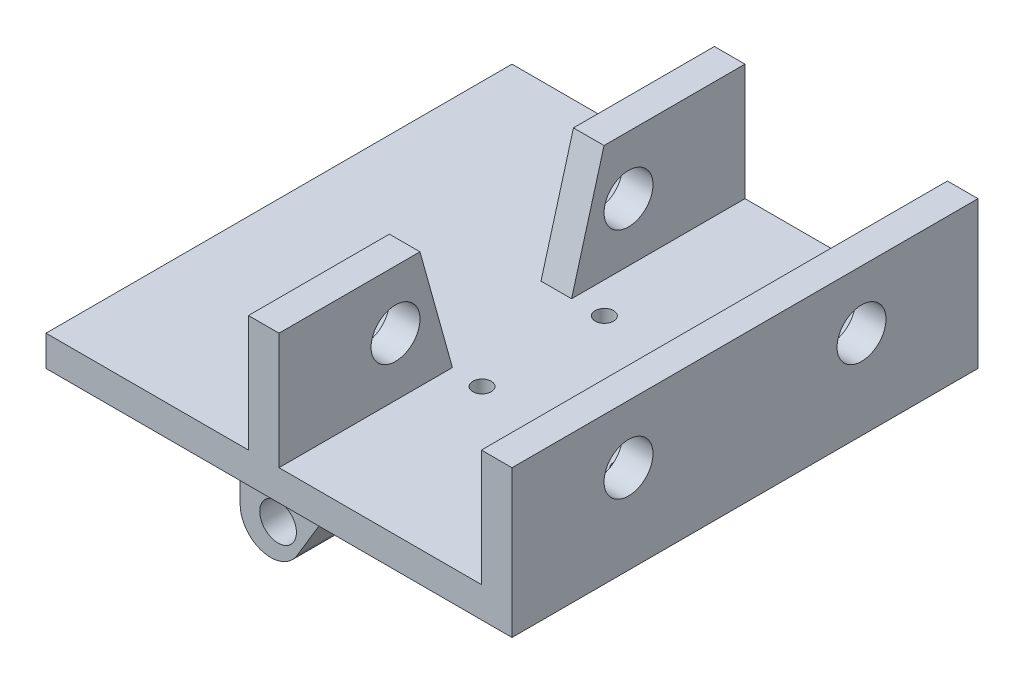
ISO-10303-21;
HEADER;
FILE_DESCRIPTION(('STEP AP214'),'2;1');
FILE_NAME('part.step','',(''),(''),'','','');
FILE_SCHEMA(('AUTOMOTIVE_DESIGN { 1 0 10303 214 1 1 1 1 }'));
ENDSEC;
DATA;
#1=APPLICATION_CONTEXT('core data for automotive mechanical design processes');
#2=APPLICATION_PROTOCOL_DEFINITION('international standard','automotive_design',2000,#1);
#3=PRODUCT_CONTEXT('',#1,'mechanical');
#4=PRODUCT('Part','Part','',(#3));
#5=PRODUCT_RELATED_PRODUCT_CATEGORY('part','',(#4));
#6=PRODUCT_DEFINITION_FORMATION('','',#4);
#7=PRODUCT_DEFINITION_CONTEXT('part definition',#1,'design');
#8=PRODUCT_DEFINITION('design','',#6,#7);
#9=PRODUCT_DEFINITION_SHAPE('','',#8);
#10=(LENGTH_UNIT() NAMED_UNIT(*) SI_UNIT(.MILLI.,.METRE.));
#11=(NAMED_UNIT(*) PLANE_ANGLE_UNIT() SI_UNIT($,.RADIAN.));
#12=(NAMED_UNIT(*) SI_UNIT($,.STERADIAN.) SOLID_ANGLE_UNIT());
#13=UNCERTAINTY_MEASURE_WITH_UNIT(LENGTH_MEASURE(1.E-05),#10,'distance_accuracy_value','');
#14=(GEOMETRIC_REPRESENTATION_CONTEXT(3) GLOBAL_UNCERTAINTY_ASSIGNED_CONTEXT((#13)) GLOBAL_UNIT_ASSIGNED_CONTEXT((#10,
#11,#12)) REPRESENTATION_CONTEXT('',''));
#15=CARTESIAN_POINT('',(0.,0.,0.));
#16=DIRECTION('',(0.,0.,1.));
#17=DIRECTION('',(1.,0.,0.));
#18=AXIS2_PLACEMENT_3D('',#15,#16,#17);
#19=CARTESIAN_POINT('',(-4.99999999999998,24.05,38.1));
#20=DIRECTION('',(0.,1.,0.));
#21=DIRECTION('',(0.,0.,1.));
#22=AXIS2_PLACEMENT_3D('',#19,#20,#21);
#23=PLANE('',#22);
#24=DIRECTION('',(1.,0.,0.));
#25=VECTOR('',#24,1.);
#26=CARTESIAN_POINT('',(-10.,24.05,15.05));
#27=LINE('',#26,#25);
#28=CARTESIAN_POINT('',(-4.99999999999998,24.05,15.05));
#29=VERTEX_POINT('',#28);
#30=CARTESIAN_POINT('',(0.,24.05,15.05));
#31=VERTEX_POINT('',#30);
#32=EDGE_CURVE('E408',#29,#31,#27,.T.);
#33=ORIENTED_EDGE('',*,*,#32,.F.);
#34=DIRECTION('',(0.,0.,1.));
#35=VECTOR('',#34,1.);
#36=CARTESIAN_POINT('',(-4.99999999999998,24.05,38.1));
#37=LINE('',#36,#35);
#38=CARTESIAN_POINT('',(-4.99999999999998,24.05,38.1));
#39=VERTEX_POINT('',#38);
#40=EDGE_CURVE('E381',#29,#39,#37,.T.);
#41=ORIENTED_EDGE('',*,*,#40,.T.);
#42=DIRECTION('',(1.,0.,0.));
#43=VECTOR('',#42,1.);
#44=CARTESIAN_POINT('',(-4.99999999999998,24.05,38.1));
#45=LINE('',#44,#43);
#46=CARTESIAN_POINT('',(0.,24.05,38.1));
#47=VERTEX_POINT('',#46);
#48=EDGE_CURVE('E204',#39,#47,#45,.T.);
#49=ORIENTED_EDGE('',*,*,#48,.T.);
#50=DIRECTION('',(0.,0.,1.));
#51=VECTOR('',#50,1.);
#52=CARTESIAN_POINT('',(0.,24.05,38.1));
#53=LINE('',#52,#51);
#54=EDGE_CURVE('E392',#31,#47,#53,.T.);
#55=ORIENTED_EDGE('',*,*,#54,.F.);
#56=EDGE_LOOP('',(#33,#41,#49,#55));
#57=FACE_BOUND('',#56,.T.);
#58=ADVANCED_FACE('F39',(#57),#23,.T.);
#59=CARTESIAN_POINT('',(-4.99999999999998,0.,0.));
#60=DIRECTION('',(-1.,0.,0.));
#61=DIRECTION('',(0.,0.,1.));
#62=AXIS2_PLACEMENT_3D('',#59,#60,#61);
#63=PLANE('',#62);
#64=DIRECTION('',(0.,0.963321996072031,0.268348154239596));
#65=VECTOR('',#64,1.);
#66=CARTESIAN_POINT('',(-4.99999999999998,-2.15865237593886,7.74917689114563));
#67=LINE('',#66,#65);
#68=CARTESIAN_POINT('',(-4.99999999999998,5.,9.74332958334934));
#69=VERTEX_POINT('',#68);
#70=EDGE_CURVE('E417',#69,#29,#67,.T.);
#71=ORIENTED_EDGE('',*,*,#70,.F.);
#72=DIRECTION('',(0.,0.,1.));
#73=VECTOR('',#72,1.);
#74=CARTESIAN_POINT('',(-4.99999999999998,5.,0.));
#75=LINE('',#74,#73);
#76=CARTESIAN_POINT('',(-4.99999999999998,5.,38.1));
#77=VERTEX_POINT('',#76);
#78=EDGE_CURVE('E197',#69,#77,#75,.T.);
#79=ORIENTED_EDGE('',*,*,#78,.T.);
#80=DIRECTION('',(0.,-1.,0.));
#81=VECTOR('',#80,1.);
#82=CARTESIAN_POINT('',(-4.99999999999998,0.,38.1));
#83=LINE('',#82,#81);
#84=EDGE_CURVE('E374',#39,#77,#83,.T.);
#85=ORIENTED_EDGE('',*,*,#84,.F.);
#86=ORIENTED_EDGE('',*,*,#40,.F.);
#87=EDGE_LOOP('',(#71,#79,#85,#86));
#88=FACE_BOUND('',#87,.T.);
#89=CARTESIAN_POINT('',(-4.99999999999998,14.525,19.05));
#90=DIRECTION('',(1.,0.,0.));
#91=DIRECTION('',(0.,0.,-1.));
#92=AXIS2_PLACEMENT_3D('',#89,#90,#91);
#93=CIRCLE('',#92,4.);
#94=CARTESIAN_POINT('',(-4.99999999999998,14.525,15.05));
#95=VERTEX_POINT('',#94);
#96=EDGE_CURVE('E366',#95,#95,#93,.T.);
#97=ORIENTED_EDGE('',*,*,#96,.T.);
#98=EDGE_LOOP('',(#97));
#99=FACE_BOUND('',#98,.T.);
#100=ADVANCED_FACE('F490',(#88,#99),#63,.T.);
#101=CARTESIAN_POINT('',(0.,0.,0.));
#102=DIRECTION('',(-1.,0.,0.));
#103=DIRECTION('',(0.,0.,1.));
#104=AXIS2_PLACEMENT_3D('',#101,#102,#103);
#105=PLANE('',#104);
#106=CARTESIAN_POINT('',(0.,14.525,19.05));
#107=DIRECTION('',(1.,0.,0.));
#108=DIRECTION('',(0.,0.,-1.));
#109=AXIS2_PLACEMENT_3D('',#106,#107,#108);
#110=CIRCLE('',#109,4.);
#111=CARTESIAN_POINT('',(0.,14.525,15.05));
#112=VERTEX_POINT('',#111);
#113=EDGE_CURVE('E362',#112,#112,#110,.T.);
#114=ORIENTED_EDGE('',*,*,#113,.F.);
#115=EDGE_LOOP('',(#114));
#116=FACE_BOUND('',#115,.T.);
#117=DIRECTION('',(0.,0.,1.));
#118=VECTOR('',#117,1.);
#119=CARTESIAN_POINT('',(0.,5.,0.));
#120=LINE('',#119,#118);
#121=CARTESIAN_POINT('',(0.,5.,9.74332958334934));
#122=VERTEX_POINT('',#121);
#123=CARTESIAN_POINT('',(0.,5.,38.1));
#124=VERTEX_POINT('',#123);
#125=EDGE_CURVE('E198',#122,#124,#120,.T.);
#126=ORIENTED_EDGE('',*,*,#125,.F.);
#127=DIRECTION('',(0.,-0.963321996072031,-0.268348154239596));
#128=VECTOR('',#127,1.);
#129=CARTESIAN_POINT('',(0.,24.05,15.05));
#130=LINE('',#129,#128);
#131=EDGE_CURVE('E55',#31,#122,#130,.T.);
#132=ORIENTED_EDGE('',*,*,#131,.F.);
#133=ORIENTED_EDGE('',*,*,#54,.T.);
#134=DIRECTION('',(0.,-1.,0.));
#135=VECTOR('',#134,1.);
#136=CARTESIAN_POINT('',(0.,0.,38.1));
#137=LINE('',#136,#135);
#138=EDGE_CURVE('E370',#47,#124,#137,.T.);
#139=ORIENTED_EDGE('',*,*,#138,.T.);
#140=EDGE_LOOP('',(#126,#132,#133,#139));
#141=FACE_BOUND('',#140,.T.);
#142=ADVANCED_FACE('F495',(#116,#141),#105,.F.);
#143=CARTESIAN_POINT('',(0.,0.,0.));
#144=DIRECTION('',(0.,1.,0.));
#145=DIRECTION('',(0.,0.,1.));
#146=AXIS2_PLACEMENT_3D('',#143,#144,#145);
#147=PLANE('',#146);
#148=CARTESIAN_POINT('',(28.1,0.,-10.));
#149=DIRECTION('',(0.,1.,0.));
#150=DIRECTION('',(0.,0.,1.));
#151=AXIS2_PLACEMENT_3D('',#148,#149,#150);
#152=CIRCLE('',#151,1.5);
#153=CARTESIAN_POINT('',(28.1,0.,-8.5));
#154=VERTEX_POINT('',#153);
#155=EDGE_CURVE('E274',#154,#154,#152,.T.);
#156=ORIENTED_EDGE('',*,*,#155,.T.);
#157=EDGE_LOOP('',(#156));
#158=FACE_BOUND('',#157,.T.);
#159=CARTESIAN_POINT('',(5.10000000000001,0.,-9.99999999999999));
#160=DIRECTION('',(0.,1.,0.));
#161=DIRECTION('',(0.,0.,1.));
#162=AXIS2_PLACEMENT_3D('',#159,#160,#161);
#163=CIRCLE('',#162,1.5);
#164=CARTESIAN_POINT('',(5.10000000000001,0.,-8.49999999999999));
#165=VERTEX_POINT('',#164);
#166=EDGE_CURVE('E266',#165,#165,#163,.T.);
#167=ORIENTED_EDGE('',*,*,#166,.T.);
#168=EDGE_LOOP('',(#167));
#169=FACE_BOUND('',#168,.T.);
#170=CARTESIAN_POINT('',(28.1,0.,10.));
#171=DIRECTION('',(0.,1.,0.));
#172=DIRECTION('',(0.,0.,-1.));
#173=AXIS2_PLACEMENT_3D('',#170,#171,#172);
#174=CIRCLE('',#173,1.5);
#175=CARTESIAN_POINT('',(28.1,0.,8.5));
#176=VERTEX_POINT('',#175);
#177=EDGE_CURVE('E258',#176,#176,#174,.T.);
#178=ORIENTED_EDGE('',*,*,#177,.T.);
#179=EDGE_LOOP('',(#178));
#180=FACE_BOUND('',#179,.T.);
#181=CARTESIAN_POINT('',(5.10000000000001,0.,9.99999999999999));
#182=DIRECTION('',(0.,1.,0.));
#183=DIRECTION('',(0.,0.,-1.));
#184=AXIS2_PLACEMENT_3D('',#181,#182,#183);
#185=CIRCLE('',#184,1.5);
#186=CARTESIAN_POINT('',(5.10000000000001,0.,8.49999999999999));
#187=VERTEX_POINT('',#186);
#188=EDGE_CURVE('E253',#187,#187,#185,.T.);
#189=ORIENTED_EDGE('',*,*,#188,.T.);
#190=EDGE_LOOP('',(#189));
#191=FACE_BOUND('',#190,.T.);
#192=DIRECTION('',(1.,0.,0.));
#193=VECTOR('',#192,1.);
#194=CARTESIAN_POINT('',(-6.09999999999999,0.,-6.34999999999999));
#195=LINE('',#194,#193);
#196=CARTESIAN_POINT('',(-38.1,0.,-6.34999999999999));
#197=VERTEX_POINT('',#196);
#198=CARTESIAN_POINT('',(-6.09999999999999,0.,-6.34999999999999));
#199=VERTEX_POINT('',#198);
#200=EDGE_CURVE('E63',#197,#199,#195,.T.);
#201=ORIENTED_EDGE('',*,*,#200,.F.);
#202=DIRECTION('',(0.,0.,1.));
#203=VECTOR('',#202,1.);
#204=CARTESIAN_POINT('',(-38.1,0.,-38.1));
#205=LINE('',#204,#203);
#206=CARTESIAN_POINT('',(-38.1,0.,-38.1));
#207=VERTEX_POINT('',#206);
#208=EDGE_CURVE('E305',#207,#197,#205,.T.);
#209=ORIENTED_EDGE('',*,*,#208,.F.);
#210=DIRECTION('',(-1.,0.,0.));
#211=VECTOR('',#210,1.);
#212=CARTESIAN_POINT('',(-38.1,0.,-38.1));
#213=LINE('',#212,#211);
#214=CARTESIAN_POINT('',(38.1,0.,-38.1));
#215=VERTEX_POINT('',#214);
#216=EDGE_CURVE('E301',#215,#207,#213,.T.);
#217=ORIENTED_EDGE('',*,*,#216,.F.);
#218=DIRECTION('',(0.,0.,-1.));
#219=VECTOR('',#218,1.);
#220=CARTESIAN_POINT('',(38.1,0.,-38.1));
#221=LINE('',#220,#219);
#222=CARTESIAN_POINT('',(38.1,0.,38.1));
#223=VERTEX_POINT('',#222);
#224=EDGE_CURVE('E282',#223,#215,#221,.T.);
#225=ORIENTED_EDGE('',*,*,#224,.F.);
#226=DIRECTION('',(1.,0.,0.));
#227=VECTOR('',#226,1.);
#228=CARTESIAN_POINT('',(-38.1,0.,38.1));
#229=LINE('',#228,#227);
#230=CARTESIAN_POINT('',(-38.1,0.,38.1));
#231=VERTEX_POINT('',#230);
#232=EDGE_CURVE('E309',#231,#223,#229,.T.);
#233=ORIENTED_EDGE('',*,*,#232,.F.);
#234=CARTESIAN_POINT('',(-38.1,0.,6.35000000000001));
#235=VERTEX_POINT('',#234);
#236=EDGE_CURVE('E304',#235,#231,#205,.T.);
#237=ORIENTED_EDGE('',*,*,#236,.F.);
#238=DIRECTION('',(1.,0.,0.));
#239=VECTOR('',#238,1.);
#240=CARTESIAN_POINT('',(-6.09999999999999,0.,6.35000000000001));
#241=LINE('',#240,#239);
#242=CARTESIAN_POINT('',(-6.09999999999999,0.,6.35000000000001));
#243=VERTEX_POINT('',#242);
#244=EDGE_CURVE('E357',#235,#243,#241,.T.);
#245=ORIENTED_EDGE('',*,*,#244,.T.);
#246=DIRECTION('',(0.,0.,-1.));
#247=VECTOR('',#246,1.);
#248=CARTESIAN_POINT('',(-6.09999999999999,0.,6.35000000000001));
#249=LINE('',#248,#247);
#250=EDGE_CURVE('E334',#243,#199,#249,.T.);
#251=ORIENTED_EDGE('',*,*,#250,.T.);
#252=EDGE_LOOP('',(#201,#209,#217,#225,#233,#237,#245,#251));
#253=FACE_BOUND('',#252,.T.);
#254=ADVANCED_FACE('F330',(#158,#169,#180,#191,#253),#147,.F.);
#255=CARTESIAN_POINT('',(0.,5.,0.));
#256=DIRECTION('',(0.,1.,0.));
#257=DIRECTION('',(0.,0.,1.));
#258=AXIS2_PLACEMENT_3D('',#255,#256,#257);
#259=PLANE('',#258);
#260=ORIENTED_EDGE('',*,*,#78,.F.);
#261=DIRECTION('',(1.,0.,0.));
#262=VECTOR('',#261,1.);
#263=CARTESIAN_POINT('',(-10.,5.,9.74332958334934));
#264=LINE('',#263,#262);
#265=EDGE_CURVE('E178',#69,#122,#264,.T.);
#266=ORIENTED_EDGE('',*,*,#265,.T.);
#267=ORIENTED_EDGE('',*,*,#125,.T.);
#268=DIRECTION('',(1.,0.,0.));
#269=VECTOR('',#268,1.);
#270=CARTESIAN_POINT('',(-38.1,5.,38.1));
#271=LINE('',#270,#269);
#272=CARTESIAN_POINT('',(33.1,5.,38.1));
#273=VERTEX_POINT('',#272);
#274=EDGE_CURVE('E292',#124,#273,#271,.T.);
#275=ORIENTED_EDGE('',*,*,#274,.T.);
#276=DIRECTION('',(0.,0.,1.));
#277=VECTOR('',#276,1.);
#278=CARTESIAN_POINT('',(33.1,5.,0.));
#279=LINE('',#278,#277);
#280=CARTESIAN_POINT('',(33.1,5.,-38.1));
#281=VERTEX_POINT('',#280);
#282=EDGE_CURVE('E246',#281,#273,#279,.T.);
#283=ORIENTED_EDGE('',*,*,#282,.F.);
#284=DIRECTION('',(-1.,0.,0.));
#285=VECTOR('',#284,1.);
#286=CARTESIAN_POINT('',(-38.1,5.,-38.1));
#287=LINE('',#286,#285);
#288=CARTESIAN_POINT('',(0.,5.,-38.1));
#289=VERTEX_POINT('',#288);
#290=EDGE_CURVE('E195',#281,#289,#287,.T.);
#291=ORIENTED_EDGE('',*,*,#290,.T.);
#292=CARTESIAN_POINT('',(0.,5.,-9.74332958334936));
#293=VERTEX_POINT('',#292);
#294=EDGE_CURVE('E184',#289,#293,#120,.T.);
#295=ORIENTED_EDGE('',*,*,#294,.T.);
#296=DIRECTION('',(1.,0.,0.));
#297=VECTOR('',#296,1.);
#298=CARTESIAN_POINT('',(-10.,5.,-9.74332958334936));
#299=LINE('',#298,#297);
#300=CARTESIAN_POINT('',(-4.99999999999998,5.,-9.74332958334936));
#301=VERTEX_POINT('',#300);
#302=EDGE_CURVE('E165',#301,#293,#299,.T.);
#303=ORIENTED_EDGE('',*,*,#302,.F.);
#304=CARTESIAN_POINT('',(-4.99999999999998,5.,-38.1));
#305=VERTEX_POINT('',#304);
#306=EDGE_CURVE('E202',#305,#301,#75,.T.);
#307=ORIENTED_EDGE('',*,*,#306,.F.);
#308=CARTESIAN_POINT('',(-38.1,5.,-38.1));
#309=VERTEX_POINT('',#308);
#310=EDGE_CURVE('E289',#305,#309,#287,.T.);
#311=ORIENTED_EDGE('',*,*,#310,.T.);
#312=DIRECTION('',(0.,0.,1.));
#313=VECTOR('',#312,1.);
#314=CARTESIAN_POINT('',(-38.1,5.,-38.1));
#315=LINE('',#314,#313);
#316=CARTESIAN_POINT('',(-38.1,5.,38.1));
#317=VERTEX_POINT('',#316);
#318=EDGE_CURVE('E288',#309,#317,#315,.T.);
#319=ORIENTED_EDGE('',*,*,#318,.T.);
#320=EDGE_CURVE('E293',#317,#77,#271,.T.);
#321=ORIENTED_EDGE('',*,*,#320,.T.);
#322=EDGE_LOOP('',(#260,#266,#267,#275,#283,#291,#295,#303,#307,#311,#319,#321));
#323=FACE_BOUND('',#322,.T.);
#324=CARTESIAN_POINT('',(28.1,5.,10.));
#325=DIRECTION('',(0.,1.,0.));
#326=DIRECTION('',(0.,0.,-1.));
#327=AXIS2_PLACEMENT_3D('',#324,#325,#326);
#328=CIRCLE('',#327,1.5);
#329=CARTESIAN_POINT('',(28.1,5.,8.5));
#330=VERTEX_POINT('',#329);
#331=EDGE_CURVE('E262',#330,#330,#328,.T.);
#332=ORIENTED_EDGE('',*,*,#331,.F.);
#333=EDGE_LOOP('',(#332));
#334=FACE_BOUND('',#333,.T.);
#335=CARTESIAN_POINT('',(28.1,5.,-10.));
#336=DIRECTION('',(0.,1.,0.));
#337=DIRECTION('',(0.,0.,1.));
#338=AXIS2_PLACEMENT_3D('',#335,#336,#337);
#339=CIRCLE('',#338,1.5);
#340=CARTESIAN_POINT('',(28.1,5.,-8.5));
#341=VERTEX_POINT('',#340);
#342=EDGE_CURVE('E278',#341,#341,#339,.T.);
#343=ORIENTED_EDGE('',*,*,#342,.F.);
#344=EDGE_LOOP('',(#343));
#345=FACE_BOUND('',#344,.T.);
#346=CARTESIAN_POINT('',(5.10000000000001,5.,-9.99999999999999));
#347=DIRECTION('',(0.,1.,0.));
#348=DIRECTION('',(0.,0.,1.));
#349=AXIS2_PLACEMENT_3D('',#346,#347,#348);
#350=CIRCLE('',#349,1.5);
#351=CARTESIAN_POINT('',(5.10000000000001,5.,-8.49999999999999));
#352=VERTEX_POINT('',#351);
#353=EDGE_CURVE('E270',#352,#352,#350,.T.);
#354=ORIENTED_EDGE('',*,*,#353,.F.);
#355=EDGE_LOOP('',(#354));
#356=FACE_BOUND('',#355,.T.);
#357=CARTESIAN_POINT('',(5.10000000000001,5.,9.99999999999999));
#358=DIRECTION('',(0.,1.,0.));
#359=DIRECTION('',(0.,0.,-1.));
#360=AXIS2_PLACEMENT_3D('',#357,#358,#359);
#361=CIRCLE('',#360,1.5);
#362=CARTESIAN_POINT('',(5.10000000000001,5.,8.49999999999999));
#363=VERTEX_POINT('',#362);
#364=EDGE_CURVE('E254',#363,#363,#361,.T.);
#365=ORIENTED_EDGE('',*,*,#364,.F.);
#366=EDGE_LOOP('',(#365));
#367=FACE_BOUND('',#366,.T.);
#368=ADVANCED_FACE('F192',(#323,#334,#345,#356,#367),#259,.T.);
#369=CARTESIAN_POINT('',(38.1,5.,-38.1));
#370=DIRECTION('',(-1.,0.,0.));
#371=DIRECTION('',(0.,0.,1.));
#372=AXIS2_PLACEMENT_3D('',#369,#370,#371);
#373=PLANE('',#372);
#374=ORIENTED_EDGE('',*,*,#224,.T.);
#375=DIRECTION('',(0.,-1.,0.));
#376=VECTOR('',#375,1.);
#377=CARTESIAN_POINT('',(38.1,5.,-38.1));
#378=LINE('',#377,#376);
#379=CARTESIAN_POINT('',(38.1,24.05,-38.1));
#380=VERTEX_POINT('',#379);
#381=EDGE_CURVE('E11',#380,#215,#378,.T.);
#382=ORIENTED_EDGE('',*,*,#381,.F.);
#383=DIRECTION('',(0.,0.,1.));
#384=VECTOR('',#383,1.);
#385=CARTESIAN_POINT('',(38.1,24.05,38.1));
#386=LINE('',#385,#384);
#387=CARTESIAN_POINT('',(38.1,24.05,38.1));
#388=VERTEX_POINT('',#387);
#389=EDGE_CURVE('E223',#380,#388,#386,.T.);
#390=ORIENTED_EDGE('',*,*,#389,.T.);
#391=DIRECTION('',(0.,-1.,0.));
#392=VECTOR('',#391,1.);
#393=CARTESIAN_POINT('',(38.1,5.,38.1));
#394=LINE('',#393,#392);
#395=EDGE_CURVE('E297',#388,#223,#394,.T.);
#396=ORIENTED_EDGE('',*,*,#395,.T.);
#397=EDGE_LOOP('',(#374,#382,#390,#396));
#398=FACE_BOUND('',#397,.T.);
#399=CARTESIAN_POINT('',(38.1,14.525,-19.05));
#400=DIRECTION('',(1.,0.,0.));
#401=DIRECTION('',(0.,0.,-1.));
#402=AXIS2_PLACEMENT_3D('',#399,#400,#401);
#403=CIRCLE('',#402,4.);
#404=CARTESIAN_POINT('',(38.1,14.525,-23.05));
#405=VERTEX_POINT('',#404);
#406=EDGE_CURVE('E210',#405,#405,#403,.T.);
#407=ORIENTED_EDGE('',*,*,#406,.F.);
#408=EDGE_LOOP('',(#407));
#409=FACE_BOUND('',#408,.T.);
#410=CARTESIAN_POINT('',(38.1,14.525,19.05));
#411=DIRECTION('',(1.,0.,0.));
#412=DIRECTION('',(0.,0.,-1.));
#413=AXIS2_PLACEMENT_3D('',#410,#411,#412);
#414=CIRCLE('',#413,4.);
#415=CARTESIAN_POINT('',(38.1,14.525,15.05));
#416=VERTEX_POINT('',#415);
#417=EDGE_CURVE('E215',#416,#416,#414,.T.);
#418=ORIENTED_EDGE('',*,*,#417,.F.);
#419=EDGE_LOOP('',(#418));
#420=FACE_BOUND('',#419,.T.);
#421=ADVANCED_FACE('F41',(#398,#409,#420),#373,.F.);
#422=CARTESIAN_POINT('',(-38.1,5.,-38.1));
#423=DIRECTION('',(0.,0.,1.));
#424=DIRECTION('',(1.,0.,0.));
#425=AXIS2_PLACEMENT_3D('',#422,#423,#424);
#426=PLANE('',#425);
#427=ORIENTED_EDGE('',*,*,#310,.F.);
#428=DIRECTION('',(0.,1.,0.));
#429=VECTOR('',#428,1.);
#430=CARTESIAN_POINT('',(-4.99999999999998,0.,-38.1));
#431=LINE('',#430,#429);
#432=CARTESIAN_POINT('',(-4.99999999999998,24.05,-38.1));
#433=VERTEX_POINT('',#432);
#434=EDGE_CURVE('E378',#305,#433,#431,.T.);
#435=ORIENTED_EDGE('',*,*,#434,.T.);
#436=DIRECTION('',(1.,0.,0.));
#437=VECTOR('',#436,1.);
#438=CARTESIAN_POINT('',(-4.99999999999998,24.05,-38.1));
#439=LINE('',#438,#437);
#440=CARTESIAN_POINT('',(0.,24.05,-38.1));
#441=VERTEX_POINT('',#440);
#442=EDGE_CURVE('E206',#433,#441,#439,.T.);
#443=ORIENTED_EDGE('',*,*,#442,.T.);
#444=DIRECTION('',(0.,1.,0.));
#445=VECTOR('',#444,1.);
#446=CARTESIAN_POINT('',(0.,0.,-38.1));
#447=LINE('',#446,#445);
#448=EDGE_CURVE('E389',#289,#441,#447,.T.);
#449=ORIENTED_EDGE('',*,*,#448,.F.);
#450=ORIENTED_EDGE('',*,*,#290,.F.);
#451=DIRECTION('',(0.,1.,0.));
#452=VECTOR('',#451,1.);
#453=CARTESIAN_POINT('',(33.1,0.,-38.1));
#454=LINE('',#453,#452);
#455=CARTESIAN_POINT('',(33.1,24.05,-38.1));
#456=VERTEX_POINT('',#455);
#457=EDGE_CURVE('E231',#281,#456,#454,.T.);
#458=ORIENTED_EDGE('',*,*,#457,.T.);
#459=DIRECTION('',(1.,0.,0.));
#460=VECTOR('',#459,1.);
#461=CARTESIAN_POINT('',(33.1,24.05,-38.1));
#462=LINE('',#461,#460);
#463=EDGE_CURVE('E238',#456,#380,#462,.T.);
#464=ORIENTED_EDGE('',*,*,#463,.T.);
#465=ORIENTED_EDGE('',*,*,#381,.T.);
#466=ORIENTED_EDGE('',*,*,#216,.T.);
#467=DIRECTION('',(0.,-1.,0.));
#468=VECTOR('',#467,1.);
#469=CARTESIAN_POINT('',(-38.1,5.,-38.1));
#470=LINE('',#469,#468);
#471=EDGE_CURVE('E48',#309,#207,#470,.T.);
#472=ORIENTED_EDGE('',*,*,#471,.F.);
#473=EDGE_LOOP('',(#427,#435,#443,#449,#450,#458,#464,#465,#466,#472));
#474=FACE_BOUND('',#473,.T.);
#475=ADVANCED_FACE('F403',(#474),#426,.F.);
#476=CARTESIAN_POINT('',(-38.1,5.,-38.1));
#477=DIRECTION('',(1.,0.,0.));
#478=DIRECTION('',(0.,0.,-1.));
#479=AXIS2_PLACEMENT_3D('',#476,#477,#478);
#480=PLANE('',#479);
#481=ORIENTED_EDGE('',*,*,#208,.T.);
#482=DIRECTION('',(0.,1.,0.));
#483=VECTOR('',#482,1.);
#484=CARTESIAN_POINT('',(-38.1,0.,-6.34999999999999));
#485=LINE('',#484,#483);
#486=CARTESIAN_POINT('',(-38.1,-35.1482677807421,-6.34999999999999));
#487=VERTEX_POINT('',#486);
#488=EDGE_CURVE('E337',#487,#197,#485,.T.);
#489=ORIENTED_EDGE('',*,*,#488,.F.);
#490=DIRECTION('',(0.,0.,-1.));
#491=VECTOR('',#490,1.);
#492=CARTESIAN_POINT('',(-38.1,-35.1482677807421,6.35000000000001));
#493=LINE('',#492,#491);
#494=CARTESIAN_POINT('',(-38.1,-35.1482677807421,6.35000000000001));
#495=VERTEX_POINT('',#494);
#496=EDGE_CURVE('E351',#495,#487,#493,.T.);
#497=ORIENTED_EDGE('',*,*,#496,.F.);
#498=DIRECTION('',(0.,1.,0.));
#499=VECTOR('',#498,1.);
#500=CARTESIAN_POINT('',(-38.1,0.,6.35000000000001));
#501=LINE('',#500,#499);
#502=EDGE_CURVE('E432',#495,#235,#501,.T.);
#503=ORIENTED_EDGE('',*,*,#502,.T.);
#504=ORIENTED_EDGE('',*,*,#236,.T.);
#505=DIRECTION('',(0.,-1.,0.));
#506=VECTOR('',#505,1.);
#507=CARTESIAN_POINT('',(-38.1,5.,38.1));
#508=LINE('',#507,#506);
#509=EDGE_CURVE('E315',#317,#231,#508,.T.);
#510=ORIENTED_EDGE('',*,*,#509,.F.);
#511=ORIENTED_EDGE('',*,*,#318,.F.);
#512=ORIENTED_EDGE('',*,*,#471,.T.);
#513=EDGE_LOOP('',(#481,#489,#497,#503,#504,#510,#511,#512));
#514=FACE_BOUND('',#513,.T.);
#515=ADVANCED_FACE('F324',(#514),#480,.F.);
#516=CARTESIAN_POINT('',(-38.1,5.,38.1));
#517=DIRECTION('',(0.,0.,-1.));
#518=DIRECTION('',(-1.,0.,0.));
#519=AXIS2_PLACEMENT_3D('',#516,#517,#518);
#520=PLANE('',#519);
#521=ORIENTED_EDGE('',*,*,#232,.T.);
#522=ORIENTED_EDGE('',*,*,#395,.F.);
#523=DIRECTION('',(1.,0.,0.));
#524=VECTOR('',#523,1.);
#525=CARTESIAN_POINT('',(33.1,24.05,38.1));
#526=LINE('',#525,#524);
#527=CARTESIAN_POINT('',(33.1,24.05,38.1));
#528=VERTEX_POINT('',#527);
#529=EDGE_CURVE('E242',#528,#388,#526,.T.);
#530=ORIENTED_EDGE('',*,*,#529,.F.);
#531=DIRECTION('',(0.,-1.,0.));
#532=VECTOR('',#531,1.);
#533=CARTESIAN_POINT('',(33.1,0.,38.1));
#534=LINE('',#533,#532);
#535=EDGE_CURVE('E227',#528,#273,#534,.T.);
#536=ORIENTED_EDGE('',*,*,#535,.T.);
#537=ORIENTED_EDGE('',*,*,#274,.F.);
#538=ORIENTED_EDGE('',*,*,#138,.F.);
#539=ORIENTED_EDGE('',*,*,#48,.F.);
#540=ORIENTED_EDGE('',*,*,#84,.T.);
#541=ORIENTED_EDGE('',*,*,#320,.F.);
#542=ORIENTED_EDGE('',*,*,#509,.T.);
#543=EDGE_LOOP('',(#521,#522,#530,#536,#537,#538,#539,#540,#541,#542));
#544=FACE_BOUND('',#543,.T.);
#545=ADVANCED_FACE('F463',(#544),#520,.F.);
#546=CARTESIAN_POINT('',(28.1,5.,-10.));
#547=DIRECTION('',(0.,-1.,0.));
#548=DIRECTION('',(0.,0.,-1.));
#549=AXIS2_PLACEMENT_3D('',#546,#547,#548);
#550=CYLINDRICAL_SURFACE('',#549,1.5);
#551=ORIENTED_EDGE('',*,*,#342,.T.);
#552=EDGE_LOOP('',(#551));
#553=FACE_BOUND('',#552,.T.);
#554=ORIENTED_EDGE('',*,*,#155,.F.);
#555=EDGE_LOOP('',(#554));
#556=FACE_BOUND('',#555,.T.);
#557=ADVANCED_FACE('F642',(#553,#556),#550,.F.);
#558=CARTESIAN_POINT('',(5.10000000000001,5.,-9.99999999999999));
#559=DIRECTION('',(0.,-1.,0.));
#560=DIRECTION('',(0.,0.,-1.));
#561=AXIS2_PLACEMENT_3D('',#558,#559,#560);
#562=CYLINDRICAL_SURFACE('',#561,1.5);
#563=ORIENTED_EDGE('',*,*,#353,.T.);
#564=EDGE_LOOP('',(#563));
#565=FACE_BOUND('',#564,.T.);
#566=ORIENTED_EDGE('',*,*,#166,.F.);
#567=EDGE_LOOP('',(#566));
#568=FACE_BOUND('',#567,.T.);
#569=ADVANCED_FACE('F648',(#565,#568),#562,.F.);
#570=CARTESIAN_POINT('',(28.1,5.,10.));
#571=DIRECTION('',(0.,-1.,0.));
#572=DIRECTION('',(0.,0.,-1.));
#573=AXIS2_PLACEMENT_3D('',#570,#571,#572);
#574=CYLINDRICAL_SURFACE('',#573,1.5);
#575=ORIENTED_EDGE('',*,*,#331,.T.);
#576=EDGE_LOOP('',(#575));
#577=FACE_BOUND('',#576,.T.);
#578=ORIENTED_EDGE('',*,*,#177,.F.);
#579=EDGE_LOOP('',(#578));
#580=FACE_BOUND('',#579,.T.);
#581=ADVANCED_FACE('F656',(#577,#580),#574,.F.);
#582=CARTESIAN_POINT('',(5.10000000000001,5.,9.99999999999999));
#583=DIRECTION('',(0.,-1.,0.));
#584=DIRECTION('',(0.,0.,-1.));
#585=AXIS2_PLACEMENT_3D('',#582,#583,#584);
#586=CYLINDRICAL_SURFACE('',#585,1.5);
#587=ORIENTED_EDGE('',*,*,#364,.T.);
#588=EDGE_LOOP('',(#587));
#589=FACE_BOUND('',#588,.T.);
#590=ORIENTED_EDGE('',*,*,#188,.F.);
#591=EDGE_LOOP('',(#590));
#592=FACE_BOUND('',#591,.T.);
#593=ADVANCED_FACE('F664',(#589,#592),#586,.F.);
#594=CARTESIAN_POINT('',(33.1,24.05,38.1));
#595=DIRECTION('',(0.,1.,0.));
#596=DIRECTION('',(0.,0.,1.));
#597=AXIS2_PLACEMENT_3D('',#594,#595,#596);
#598=PLANE('',#597);
#599=ORIENTED_EDGE('',*,*,#389,.F.);
#600=ORIENTED_EDGE('',*,*,#463,.F.);
#601=DIRECTION('',(0.,0.,1.));
#602=VECTOR('',#601,1.);
#603=CARTESIAN_POINT('',(33.1,24.05,38.1));
#604=LINE('',#603,#602);
#605=EDGE_CURVE('E234',#456,#528,#604,.T.);
#606=ORIENTED_EDGE('',*,*,#605,.T.);
#607=ORIENTED_EDGE('',*,*,#529,.T.);
#608=EDGE_LOOP('',(#599,#600,#606,#607));
#609=FACE_BOUND('',#608,.T.);
#610=ADVANCED_FACE('F466',(#609),#598,.T.);
#611=CARTESIAN_POINT('',(33.1,0.,0.));
#612=DIRECTION('',(-1.,0.,0.));
#613=DIRECTION('',(0.,0.,1.));
#614=AXIS2_PLACEMENT_3D('',#611,#612,#613);
#615=PLANE('',#614);
#616=CARTESIAN_POINT('',(33.1,14.525,-19.05));
#617=DIRECTION('',(1.,0.,0.));
#618=DIRECTION('',(0.,0.,-1.));
#619=AXIS2_PLACEMENT_3D('',#616,#617,#618);
#620=CIRCLE('',#619,4.);
#621=CARTESIAN_POINT('',(33.1,14.525,-23.05));
#622=VERTEX_POINT('',#621);
#623=EDGE_CURVE('E211',#622,#622,#620,.T.);
#624=ORIENTED_EDGE('',*,*,#623,.T.);
#625=EDGE_LOOP('',(#624));
#626=FACE_BOUND('',#625,.T.);
#627=CARTESIAN_POINT('',(33.1,14.525,19.05));
#628=DIRECTION('',(1.,0.,0.));
#629=DIRECTION('',(0.,0.,-1.));
#630=AXIS2_PLACEMENT_3D('',#627,#628,#629);
#631=CIRCLE('',#630,4.);
#632=CARTESIAN_POINT('',(33.1,14.525,15.05));
#633=VERTEX_POINT('',#632);
#634=EDGE_CURVE('E219',#633,#633,#631,.T.);
#635=ORIENTED_EDGE('',*,*,#634,.T.);
#636=EDGE_LOOP('',(#635));
#637=FACE_BOUND('',#636,.T.);
#638=ORIENTED_EDGE('',*,*,#457,.F.);
#639=ORIENTED_EDGE('',*,*,#282,.T.);
#640=ORIENTED_EDGE('',*,*,#535,.F.);
#641=ORIENTED_EDGE('',*,*,#605,.F.);
#642=EDGE_LOOP('',(#638,#639,#640,#641));
#643=FACE_BOUND('',#642,.T.);
#644=ADVANCED_FACE('F461',(#626,#637,#643),#615,.T.);
#645=CARTESIAN_POINT('',(33.1,14.525,19.05));
#646=DIRECTION('',(1.,0.,0.));
#647=DIRECTION('',(0.,0.,-1.));
#648=AXIS2_PLACEMENT_3D('',#645,#646,#647);
#649=CYLINDRICAL_SURFACE('',#648,4.);
#650=ORIENTED_EDGE('',*,*,#634,.F.);
#651=EDGE_LOOP('',(#650));
#652=FACE_BOUND('',#651,.T.);
#653=ORIENTED_EDGE('',*,*,#417,.T.);
#654=EDGE_LOOP('',(#653));
#655=FACE_BOUND('',#654,.T.);
#656=ADVANCED_FACE('F475',(#652,#655),#649,.F.);
#657=CARTESIAN_POINT('',(33.1,14.525,-19.05));
#658=DIRECTION('',(1.,0.,0.));
#659=DIRECTION('',(0.,0.,-1.));
#660=AXIS2_PLACEMENT_3D('',#657,#658,#659);
#661=CYLINDRICAL_SURFACE('',#660,4.);
#662=ORIENTED_EDGE('',*,*,#623,.F.);
#663=EDGE_LOOP('',(#662));
#664=FACE_BOUND('',#663,.T.);
#665=ORIENTED_EDGE('',*,*,#406,.T.);
#666=EDGE_LOOP('',(#665));
#667=FACE_BOUND('',#666,.T.);
#668=ADVANCED_FACE('F477',(#664,#667),#661,.F.);
#669=DIRECTION('',(1.,0.,0.));
#670=VECTOR('',#669,1.);
#671=CARTESIAN_POINT('',(-10.,24.05,-15.05));
#672=LINE('',#671,#670);
#673=CARTESIAN_POINT('',(-4.99999999999998,24.05,-15.05));
#674=VERTEX_POINT('',#673);
#675=CARTESIAN_POINT('',(0.,24.05,-15.05));
#676=VERTEX_POINT('',#675);
#677=EDGE_CURVE('E177',#674,#676,#672,.T.);
#678=ORIENTED_EDGE('',*,*,#677,.T.);
#679=EDGE_CURVE('E187',#441,#676,#53,.T.);
#680=ORIENTED_EDGE('',*,*,#679,.F.);
#681=ORIENTED_EDGE('',*,*,#442,.F.);
#682=EDGE_CURVE('E382',#433,#674,#37,.T.);
#683=ORIENTED_EDGE('',*,*,#682,.T.);
#684=EDGE_LOOP('',(#678,#680,#681,#683));
#685=FACE_BOUND('',#684,.T.);
#686=ADVANCED_FACE('F406',(#685),#23,.T.);
#687=DIRECTION('',(0.,-0.963321996072031,0.268348154239596));
#688=VECTOR('',#687,1.);
#689=CARTESIAN_POINT('',(-4.99999999999998,-2.15865237593887,-7.74917689114565));
#690=LINE('',#689,#688);
#691=EDGE_CURVE('E171',#674,#301,#690,.T.);
#692=ORIENTED_EDGE('',*,*,#691,.F.);
#693=ORIENTED_EDGE('',*,*,#682,.F.);
#694=ORIENTED_EDGE('',*,*,#434,.F.);
#695=ORIENTED_EDGE('',*,*,#306,.T.);
#696=EDGE_LOOP('',(#692,#693,#694,#695));
#697=FACE_BOUND('',#696,.T.);
#698=CARTESIAN_POINT('',(-4.99999999999998,14.525,-19.05));
#699=DIRECTION('',(1.,0.,0.));
#700=DIRECTION('',(0.,0.,-1.));
#701=AXIS2_PLACEMENT_3D('',#698,#699,#700);
#702=CIRCLE('',#701,4.);
#703=CARTESIAN_POINT('',(-4.99999999999998,14.525,-23.05));
#704=VERTEX_POINT('',#703);
#705=EDGE_CURVE('E358',#704,#704,#702,.T.);
#706=ORIENTED_EDGE('',*,*,#705,.T.);
#707=EDGE_LOOP('',(#706));
#708=FACE_BOUND('',#707,.T.);
#709=ADVANCED_FACE('F498',(#697,#708),#63,.T.);
#710=ORIENTED_EDGE('',*,*,#679,.T.);
#711=DIRECTION('',(0.,0.963321996072031,-0.268348154239596));
#712=VECTOR('',#711,1.);
#713=CARTESIAN_POINT('',(0.,24.05,-15.05));
#714=LINE('',#713,#712);
#715=EDGE_CURVE('E168',#293,#676,#714,.T.);
#716=ORIENTED_EDGE('',*,*,#715,.F.);
#717=ORIENTED_EDGE('',*,*,#294,.F.);
#718=ORIENTED_EDGE('',*,*,#448,.T.);
#719=EDGE_LOOP('',(#710,#716,#717,#718));
#720=FACE_BOUND('',#719,.T.);
#721=CARTESIAN_POINT('',(0.,14.525,-19.05));
#722=DIRECTION('',(1.,0.,0.));
#723=DIRECTION('',(0.,0.,-1.));
#724=AXIS2_PLACEMENT_3D('',#721,#722,#723);
#725=CIRCLE('',#724,4.);
#726=CARTESIAN_POINT('',(0.,14.525,-23.05));
#727=VERTEX_POINT('',#726);
#728=EDGE_CURVE('E350',#727,#727,#725,.T.);
#729=ORIENTED_EDGE('',*,*,#728,.F.);
#730=EDGE_LOOP('',(#729));
#731=FACE_BOUND('',#730,.T.);
#732=ADVANCED_FACE('F182',(#720,#731),#105,.F.);
#733=CARTESIAN_POINT('',(-4.99999999999998,14.525,19.05));
#734=DIRECTION('',(1.,0.,0.));
#735=DIRECTION('',(0.,0.,-1.));
#736=AXIS2_PLACEMENT_3D('',#733,#734,#735);
#737=CYLINDRICAL_SURFACE('',#736,4.);
#738=ORIENTED_EDGE('',*,*,#96,.F.);
#739=EDGE_LOOP('',(#738));
#740=FACE_BOUND('',#739,.T.);
#741=ORIENTED_EDGE('',*,*,#113,.T.);
#742=EDGE_LOOP('',(#741));
#743=FACE_BOUND('',#742,.T.);
#744=ADVANCED_FACE('F509',(#740,#743),#737,.F.);
#745=CARTESIAN_POINT('',(-4.99999999999998,14.525,-19.05));
#746=DIRECTION('',(1.,0.,0.));
#747=DIRECTION('',(0.,0.,-1.));
#748=AXIS2_PLACEMENT_3D('',#745,#746,#747);
#749=CYLINDRICAL_SURFACE('',#748,4.);
#750=ORIENTED_EDGE('',*,*,#705,.F.);
#751=EDGE_LOOP('',(#750));
#752=FACE_BOUND('',#751,.T.);
#753=ORIENTED_EDGE('',*,*,#728,.T.);
#754=EDGE_LOOP('',(#753));
#755=FACE_BOUND('',#754,.T.);
#756=ADVANCED_FACE('F514',(#752,#755),#749,.F.);
#757=CARTESIAN_POINT('',(-28.8165524975716,-37.7274299497305,6.35000000000001));
#758=DIRECTION('',(0.856689500485658,-0.515832433797676,0.));
#759=DIRECTION('',(0.515832433797676,0.856689500485658,0.));
#760=AXIS2_PLACEMENT_3D('',#757,#758,#759);
#761=PLANE('',#760);
#762=DIRECTION('',(-0.515832433797676,-0.856689500485658,0.));
#763=VECTOR('',#762,1.);
#764=CARTESIAN_POINT('',(-28.8165524975716,-37.7274299497305,-6.34999999999999));
#765=LINE('',#764,#763);
#766=CARTESIAN_POINT('',(-28.8165524975716,-37.7274299497305,-6.34999999999999));
#767=VERTEX_POINT('',#766);
#768=EDGE_CURVE('E425',#199,#767,#765,.T.);
#769=ORIENTED_EDGE('',*,*,#768,.F.);
#770=ORIENTED_EDGE('',*,*,#250,.F.);
#771=DIRECTION('',(-0.515832433797676,-0.856689500485658,0.));
#772=VECTOR('',#771,1.);
#773=CARTESIAN_POINT('',(-28.8165524975716,-37.7274299497305,6.35000000000001));
#774=LINE('',#773,#772);
#775=CARTESIAN_POINT('',(-28.8165524975716,-37.7274299497305,6.35000000000001));
#776=VERTEX_POINT('',#775);
#777=EDGE_CURVE('E336',#243,#776,#774,.T.);
#778=ORIENTED_EDGE('',*,*,#777,.T.);
#779=DIRECTION('',(0.,0.,-1.));
#780=VECTOR('',#779,1.);
#781=CARTESIAN_POINT('',(-28.8165524975716,-37.7274299497305,6.35000000000001));
#782=LINE('',#781,#780);
#783=EDGE_CURVE('E354',#776,#767,#782,.T.);
#784=ORIENTED_EDGE('',*,*,#783,.T.);
#785=EDGE_LOOP('',(#769,#770,#778,#784));
#786=FACE_BOUND('',#785,.T.);
#787=ADVANCED_FACE('F518',(#786),#761,.T.);
#788=CARTESIAN_POINT('',(-33.1,-35.1482677807424,6.35000000000001));
#789=DIRECTION('',(0.,0.,-1.));
#790=DIRECTION('',(-1.,0.,0.));
#791=AXIS2_PLACEMENT_3D('',#788,#789,#790);
#792=CYLINDRICAL_SURFACE('',#791,5.);
#793=CARTESIAN_POINT('',(-33.1,-35.1482677807424,-6.34999999999999));
#794=DIRECTION('',(0.,0.,-1.));
#795=DIRECTION('',(1.,0.,0.));
#796=AXIS2_PLACEMENT_3D('',#793,#794,#795);
#797=CIRCLE('',#796,5.);
#798=EDGE_CURVE('E344',#767,#487,#797,.T.);
#799=ORIENTED_EDGE('',*,*,#798,.F.);
#800=ORIENTED_EDGE('',*,*,#783,.F.);
#801=CARTESIAN_POINT('',(-33.1,-35.1482677807424,6.35000000000001));
#802=DIRECTION('',(0.,0.,-1.));
#803=DIRECTION('',(1.,0.,0.));
#804=AXIS2_PLACEMENT_3D('',#801,#802,#803);
#805=CIRCLE('',#804,5.);
#806=EDGE_CURVE('E342',#776,#495,#805,.T.);
#807=ORIENTED_EDGE('',*,*,#806,.T.);
#808=ORIENTED_EDGE('',*,*,#496,.T.);
#809=EDGE_LOOP('',(#799,#800,#807,#808));
#810=FACE_BOUND('',#809,.T.);
#811=ADVANCED_FACE('F443',(#810),#792,.T.);
#812=CARTESIAN_POINT('',(-33.1,-35.1482677807424,6.35000000000001));
#813=DIRECTION('',(0.,0.,1.));
#814=DIRECTION('',(1.,0.,0.));
#815=AXIS2_PLACEMENT_3D('',#812,#813,#814);
#816=PLANE('',#815);
#817=CARTESIAN_POINT('',(-31.9,-34.5,6.35000000000001));
#818=DIRECTION('',(0.,0.,-1.));
#819=DIRECTION('',(-1.,0.,0.));
#820=AXIS2_PLACEMENT_3D('',#817,#818,#819);
#821=CIRCLE('',#820,3.);
#822=CARTESIAN_POINT('',(-34.9,-34.5,6.35000000000001));
#823=VERTEX_POINT('',#822);
#824=EDGE_CURVE('E421',#823,#823,#821,.T.);
#825=ORIENTED_EDGE('',*,*,#824,.T.);
#826=EDGE_LOOP('',(#825));
#827=FACE_BOUND('',#826,.T.);
#828=ORIENTED_EDGE('',*,*,#777,.F.);
#829=ORIENTED_EDGE('',*,*,#244,.F.);
#830=ORIENTED_EDGE('',*,*,#502,.F.);
#831=ORIENTED_EDGE('',*,*,#806,.F.);
#832=EDGE_LOOP('',(#828,#829,#830,#831));
#833=FACE_BOUND('',#832,.T.);
#834=ADVANCED_FACE('F449',(#827,#833),#816,.T.);
#835=CARTESIAN_POINT('',(-33.1,-35.1482677807424,-6.34999999999999));
#836=DIRECTION('',(0.,0.,1.));
#837=DIRECTION('',(1.,0.,0.));
#838=AXIS2_PLACEMENT_3D('',#835,#836,#837);
#839=PLANE('',#838);
#840=CARTESIAN_POINT('',(-31.9,-34.5,-6.34999999999999));
#841=DIRECTION('',(0.,0.,-1.));
#842=DIRECTION('',(-1.,0.,0.));
#843=AXIS2_PLACEMENT_3D('',#840,#841,#842);
#844=CIRCLE('',#843,3.);
#845=CARTESIAN_POINT('',(-34.9,-34.5,-6.34999999999999));
#846=VERTEX_POINT('',#845);
#847=EDGE_CURVE('E420',#846,#846,#844,.T.);
#848=ORIENTED_EDGE('',*,*,#847,.F.);
#849=EDGE_LOOP('',(#848));
#850=FACE_BOUND('',#849,.T.);
#851=ORIENTED_EDGE('',*,*,#768,.T.);
#852=ORIENTED_EDGE('',*,*,#798,.T.);
#853=ORIENTED_EDGE('',*,*,#488,.T.);
#854=ORIENTED_EDGE('',*,*,#200,.T.);
#855=EDGE_LOOP('',(#851,#852,#853,#854));
#856=FACE_BOUND('',#855,.T.);
#857=ADVANCED_FACE('F441',(#850,#856),#839,.F.);
#858=CARTESIAN_POINT('',(-31.9,-34.5,6.35000000000001));
#859=DIRECTION('',(0.,0.,-1.));
#860=DIRECTION('',(-1.,0.,0.));
#861=AXIS2_PLACEMENT_3D('',#858,#859,#860);
#862=CYLINDRICAL_SURFACE('',#861,3.);
#863=ORIENTED_EDGE('',*,*,#824,.F.);
#864=EDGE_LOOP('',(#863));
#865=FACE_BOUND('',#864,.T.);
#866=ORIENTED_EDGE('',*,*,#847,.T.);
#867=EDGE_LOOP('',(#866));
#868=FACE_BOUND('',#867,.T.);
#869=ADVANCED_FACE('F527',(#865,#868),#862,.F.);
#870=CARTESIAN_POINT('',(-10.,24.05,15.05));
#871=DIRECTION('',(0.,-0.268348154239596,0.963321996072031));
#872=DIRECTION('',(0.,-0.963321996072031,-0.268348154239596));
#873=AXIS2_PLACEMENT_3D('',#870,#871,#872);
#874=PLANE('',#873);
#875=ORIENTED_EDGE('',*,*,#70,.T.);
#876=ORIENTED_EDGE('',*,*,#32,.T.);
#877=ORIENTED_EDGE('',*,*,#131,.T.);
#878=ORIENTED_EDGE('',*,*,#265,.F.);
#879=EDGE_LOOP('',(#875,#876,#877,#878));
#880=FACE_BOUND('',#879,.T.);
#881=ADVANCED_FACE('F534',(#880),#874,.F.);
#882=CARTESIAN_POINT('',(-10.,24.05,-15.05));
#883=DIRECTION('',(0.,-0.268348154239596,-0.963321996072031));
#884=DIRECTION('',(0.,0.963321996072031,-0.268348154239596));
#885=AXIS2_PLACEMENT_3D('',#882,#883,#884);
#886=PLANE('',#885);
#887=ORIENTED_EDGE('',*,*,#691,.T.);
#888=ORIENTED_EDGE('',*,*,#302,.T.);
#889=ORIENTED_EDGE('',*,*,#715,.T.);
#890=ORIENTED_EDGE('',*,*,#677,.F.);
#891=EDGE_LOOP('',(#887,#888,#889,#890));
#892=FACE_BOUND('',#891,.T.);
#893=ADVANCED_FACE('F167',(#892),#886,.F.);
#894=CLOSED_SHELL('',(#58,#100,#142,#254,#368,#421,#475,#515,#545,#557,#569,#581,#593,#610,#644,
#656,#668,#686,#709,#732,#744,#756,#787,#811,#834,#857,#869,#881,#893));
#895=MANIFOLD_SOLID_BREP('B2',#894);
#896=ADVANCED_BREP_SHAPE_REPRESENTATION('',(#18,#895),#14);
#897=SHAPE_DEFINITION_REPRESENTATION(#9,#896);
ENDSEC;
END-ISO-10303-21;
